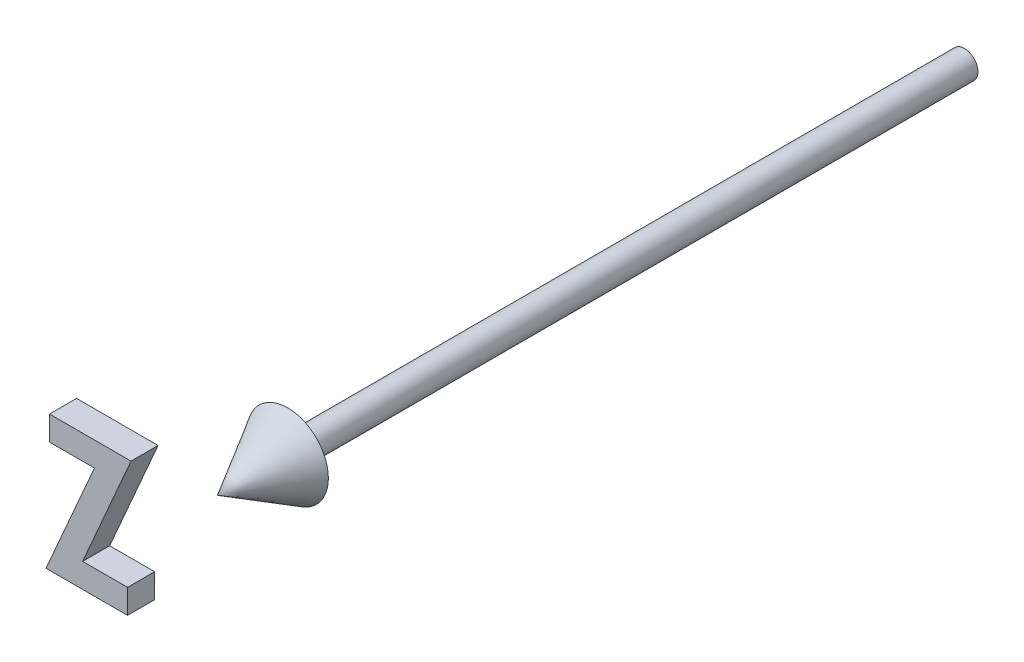
ISO-10303-21;
HEADER;
FILE_DESCRIPTION(('STEP AP214'),'2;1');
FILE_NAME('part.step','',(''),(''),'','','');
FILE_SCHEMA(('AUTOMOTIVE_DESIGN { 1 0 10303 214 1 1 1 1 }'));
ENDSEC;
DATA;
#1=APPLICATION_CONTEXT('core data for automotive mechanical design processes');
#2=APPLICATION_PROTOCOL_DEFINITION('international standard','automotive_design',2000,#1);
#3=PRODUCT_CONTEXT('',#1,'mechanical');
#4=PRODUCT('Part','Part','',(#3));
#5=PRODUCT_RELATED_PRODUCT_CATEGORY('part','',(#4));
#6=PRODUCT_DEFINITION_FORMATION('','',#4);
#7=PRODUCT_DEFINITION_CONTEXT('part definition',#1,'design');
#8=PRODUCT_DEFINITION('design','',#6,#7);
#9=PRODUCT_DEFINITION_SHAPE('','',#8);
#10=(LENGTH_UNIT() NAMED_UNIT(*) SI_UNIT(.MILLI.,.METRE.));
#11=(NAMED_UNIT(*) PLANE_ANGLE_UNIT() SI_UNIT($,.RADIAN.));
#12=(NAMED_UNIT(*) SI_UNIT($,.STERADIAN.) SOLID_ANGLE_UNIT());
#13=UNCERTAINTY_MEASURE_WITH_UNIT(LENGTH_MEASURE(1.E-05),#10,'distance_accuracy_value','');
#14=(GEOMETRIC_REPRESENTATION_CONTEXT(3) GLOBAL_UNCERTAINTY_ASSIGNED_CONTEXT((#13)) GLOBAL_UNIT_ASSIGNED_CONTEXT((#10,
#11,#12)) REPRESENTATION_CONTEXT('',''));
#15=CARTESIAN_POINT('',(0.,0.,0.));
#16=DIRECTION('',(0.,0.,1.));
#17=DIRECTION('',(1.,0.,0.));
#18=AXIS2_PLACEMENT_3D('',#15,#16,#17);
#19=CARTESIAN_POINT('',(-5.64102564102564,-8.2051282051282,56.1961524227066));
#20=DIRECTION('',(1.,0.,0.));
#21=DIRECTION('',(0.,0.,-1.));
#22=AXIS2_PLACEMENT_3D('',#19,#20,#21);
#23=PLANE('',#22);
#24=DIRECTION('',(0.,-1.,0.));
#25=VECTOR('',#24,1.);
#26=CARTESIAN_POINT('',(-5.64102564102564,-8.2051282051282,54.1961524227066));
#27=LINE('',#26,#25);
#28=CARTESIAN_POINT('',(-5.64102564102564,-8.2051282051282,54.1961524227066));
#29=VERTEX_POINT('',#28);
#30=CARTESIAN_POINT('',(-5.64102564102564,-10.,54.1961524227066));
#31=VERTEX_POINT('',#30);
#32=EDGE_CURVE('E149',#29,#31,#27,.T.);
#33=ORIENTED_EDGE('',*,*,#32,.F.);
#34=DIRECTION('',(0.,0.,-1.));
#35=VECTOR('',#34,1.);
#36=CARTESIAN_POINT('',(-5.64102564102564,-8.2051282051282,56.1961524227066));
#37=LINE('',#36,#35);
#38=CARTESIAN_POINT('',(-5.64102564102564,-8.2051282051282,56.1961524227066));
#39=VERTEX_POINT('',#38);
#40=EDGE_CURVE('E12',#39,#29,#37,.T.);
#41=ORIENTED_EDGE('',*,*,#40,.F.);
#42=DIRECTION('',(0.,-1.,0.));
#43=VECTOR('',#42,1.);
#44=CARTESIAN_POINT('',(-5.64102564102564,-8.2051282051282,56.1961524227066));
#45=LINE('',#44,#43);
#46=CARTESIAN_POINT('',(-5.64102564102564,-10.,56.1961524227066));
#47=VERTEX_POINT('',#46);
#48=EDGE_CURVE('E169',#39,#47,#45,.T.);
#49=ORIENTED_EDGE('',*,*,#48,.T.);
#50=DIRECTION('',(0.,0.,-1.));
#51=VECTOR('',#50,1.);
#52=CARTESIAN_POINT('',(-5.64102564102564,-10.,56.1961524227066));
#53=LINE('',#52,#51);
#54=EDGE_CURVE('E55',#47,#31,#53,.T.);
#55=ORIENTED_EDGE('',*,*,#54,.T.);
#56=EDGE_LOOP('',(#33,#41,#49,#55));
#57=FACE_BOUND('',#56,.T.);
#58=ADVANCED_FACE('F52',(#57),#23,.T.);
#59=CARTESIAN_POINT('',(-8.96233974358974,-8.2051282051282,56.1961524227066));
#60=DIRECTION('',(0.,1.,0.));
#61=DIRECTION('',(0.,0.,1.));
#62=AXIS2_PLACEMENT_3D('',#59,#60,#61);
#63=PLANE('',#62);
#64=DIRECTION('',(1.,0.,0.));
#65=VECTOR('',#64,1.);
#66=CARTESIAN_POINT('',(-8.96233974358974,-8.2051282051282,54.1961524227066));
#67=LINE('',#66,#65);
#68=CARTESIAN_POINT('',(-8.96233974358974,-8.2051282051282,54.1961524227066));
#69=VERTEX_POINT('',#68);
#70=EDGE_CURVE('E167',#69,#29,#67,.T.);
#71=ORIENTED_EDGE('',*,*,#70,.F.);
#72=DIRECTION('',(0.,0.,-1.));
#73=VECTOR('',#72,1.);
#74=CARTESIAN_POINT('',(-8.96233974358974,-8.2051282051282,56.1961524227066));
#75=LINE('',#74,#73);
#76=CARTESIAN_POINT('',(-8.96233974358974,-8.2051282051282,56.1961524227066));
#77=VERTEX_POINT('',#76);
#78=EDGE_CURVE('E61',#77,#69,#75,.T.);
#79=ORIENTED_EDGE('',*,*,#78,.F.);
#80=DIRECTION('',(1.,0.,0.));
#81=VECTOR('',#80,1.);
#82=CARTESIAN_POINT('',(-8.96233974358974,-8.2051282051282,56.1961524227066));
#83=LINE('',#82,#81);
#84=EDGE_CURVE('E139',#77,#39,#83,.T.);
#85=ORIENTED_EDGE('',*,*,#84,.T.);
#86=ORIENTED_EDGE('',*,*,#40,.T.);
#87=EDGE_LOOP('',(#71,#79,#85,#86));
#88=FACE_BOUND('',#87,.T.);
#89=ADVANCED_FACE('F181',(#88),#63,.T.);
#90=CARTESIAN_POINT('',(-5.38461538461539,0.,56.1961524227066));
#91=DIRECTION('',(0.916649716583048,-0.399691502396808,0.));
#92=DIRECTION('',(0.399691502396808,0.916649716583048,0.));
#93=AXIS2_PLACEMENT_3D('',#90,#91,#92);
#94=PLANE('',#93);
#95=DIRECTION('',(-0.399691502396808,-0.916649716583048,0.));
#96=VECTOR('',#95,1.);
#97=CARTESIAN_POINT('',(-5.38461538461539,0.,54.1961524227066));
#98=LINE('',#97,#96);
#99=CARTESIAN_POINT('',(-5.38461538461539,0.,54.1961524227066));
#100=VERTEX_POINT('',#99);
#101=EDGE_CURVE('E126',#100,#69,#98,.T.);
#102=ORIENTED_EDGE('',*,*,#101,.F.);
#103=DIRECTION('',(0.,0.,-1.));
#104=VECTOR('',#103,1.);
#105=CARTESIAN_POINT('',(-5.38461538461539,0.,56.1961524227066));
#106=LINE('',#105,#104);
#107=CARTESIAN_POINT('',(-5.38461538461539,0.,56.1961524227066));
#108=VERTEX_POINT('',#107);
#109=EDGE_CURVE('E121',#108,#100,#106,.T.);
#110=ORIENTED_EDGE('',*,*,#109,.F.);
#111=DIRECTION('',(-0.399691502396808,-0.916649716583048,0.));
#112=VECTOR('',#111,1.);
#113=CARTESIAN_POINT('',(-5.38461538461539,0.,56.1961524227066));
#114=LINE('',#113,#112);
#115=EDGE_CURVE('E124',#108,#77,#114,.T.);
#116=ORIENTED_EDGE('',*,*,#115,.T.);
#117=ORIENTED_EDGE('',*,*,#78,.T.);
#118=EDGE_LOOP('',(#102,#110,#116,#117));
#119=FACE_BOUND('',#118,.T.);
#120=ADVANCED_FACE('F123',(#119),#94,.T.);
#121=CARTESIAN_POINT('',(-11.4102564102564,0.,56.1961524227066));
#122=DIRECTION('',(0.,1.,0.));
#123=DIRECTION('',(0.,0.,1.));
#124=AXIS2_PLACEMENT_3D('',#121,#122,#123);
#125=PLANE('',#124);
#126=DIRECTION('',(1.,0.,0.));
#127=VECTOR('',#126,1.);
#128=CARTESIAN_POINT('',(-11.4102564102564,0.,54.1961524227066));
#129=LINE('',#128,#127);
#130=CARTESIAN_POINT('',(-11.4102564102564,0.,54.1961524227066));
#131=VERTEX_POINT('',#130);
#132=EDGE_CURVE('E164',#131,#100,#129,.T.);
#133=ORIENTED_EDGE('',*,*,#132,.F.);
#134=DIRECTION('',(0.,0.,-1.));
#135=VECTOR('',#134,1.);
#136=CARTESIAN_POINT('',(-11.4102564102564,0.,56.1961524227066));
#137=LINE('',#136,#135);
#138=CARTESIAN_POINT('',(-11.4102564102564,0.,56.1961524227066));
#139=VERTEX_POINT('',#138);
#140=EDGE_CURVE('E131',#139,#131,#137,.T.);
#141=ORIENTED_EDGE('',*,*,#140,.F.);
#142=DIRECTION('',(1.,0.,0.));
#143=VECTOR('',#142,1.);
#144=CARTESIAN_POINT('',(-11.4102564102564,0.,56.1961524227066));
#145=LINE('',#144,#143);
#146=EDGE_CURVE('E137',#139,#108,#145,.T.);
#147=ORIENTED_EDGE('',*,*,#146,.T.);
#148=ORIENTED_EDGE('',*,*,#109,.T.);
#149=EDGE_LOOP('',(#133,#141,#147,#148));
#150=FACE_BOUND('',#149,.T.);
#151=ADVANCED_FACE('F141',(#150),#125,.T.);
#152=CARTESIAN_POINT('',(-11.4102564102564,-1.79487179487179,56.1961524227066));
#153=DIRECTION('',(-1.,0.,0.));
#154=DIRECTION('',(0.,0.,1.));
#155=AXIS2_PLACEMENT_3D('',#152,#153,#154);
#156=PLANE('',#155);
#157=DIRECTION('',(0.,1.,0.));
#158=VECTOR('',#157,1.);
#159=CARTESIAN_POINT('',(-11.4102564102564,-1.79487179487179,54.1961524227066));
#160=LINE('',#159,#158);
#161=CARTESIAN_POINT('',(-11.4102564102564,-1.79487179487179,54.1961524227066));
#162=VERTEX_POINT('',#161);
#163=EDGE_CURVE('E161',#162,#131,#160,.T.);
#164=ORIENTED_EDGE('',*,*,#163,.F.);
#165=DIRECTION('',(0.,0.,-1.));
#166=VECTOR('',#165,1.);
#167=CARTESIAN_POINT('',(-11.4102564102564,-1.79487179487179,56.1961524227066));
#168=LINE('',#167,#166);
#169=CARTESIAN_POINT('',(-11.4102564102564,-1.79487179487179,56.1961524227066));
#170=VERTEX_POINT('',#169);
#171=EDGE_CURVE('E173',#170,#162,#168,.T.);
#172=ORIENTED_EDGE('',*,*,#171,.F.);
#173=DIRECTION('',(0.,1.,0.));
#174=VECTOR('',#173,1.);
#175=CARTESIAN_POINT('',(-11.4102564102564,-1.79487179487179,56.1961524227066));
#176=LINE('',#175,#174);
#177=EDGE_CURVE('E142',#170,#139,#176,.T.);
#178=ORIENTED_EDGE('',*,*,#177,.T.);
#179=ORIENTED_EDGE('',*,*,#140,.T.);
#180=EDGE_LOOP('',(#164,#172,#178,#179));
#181=FACE_BOUND('',#180,.T.);
#182=ADVANCED_FACE('F194',(#181),#156,.T.);
#183=CARTESIAN_POINT('',(-8.0869391025641,-1.79487179487179,56.1961524227066));
#184=DIRECTION('',(0.,-1.,0.));
#185=DIRECTION('',(0.,0.,-1.));
#186=AXIS2_PLACEMENT_3D('',#183,#184,#185);
#187=PLANE('',#186);
#188=DIRECTION('',(-1.,0.,0.));
#189=VECTOR('',#188,1.);
#190=CARTESIAN_POINT('',(-8.0869391025641,-1.79487179487179,54.1961524227066));
#191=LINE('',#190,#189);
#192=CARTESIAN_POINT('',(-8.0869391025641,-1.79487179487179,54.1961524227066));
#193=VERTEX_POINT('',#192);
#194=EDGE_CURVE('E158',#193,#162,#191,.T.);
#195=ORIENTED_EDGE('',*,*,#194,.F.);
#196=DIRECTION('',(0.,0.,-1.));
#197=VECTOR('',#196,1.);
#198=CARTESIAN_POINT('',(-8.0869391025641,-1.79487179487179,56.1961524227066));
#199=LINE('',#198,#197);
#200=CARTESIAN_POINT('',(-8.0869391025641,-1.79487179487179,56.1961524227066));
#201=VERTEX_POINT('',#200);
#202=EDGE_CURVE('E175',#201,#193,#199,.T.);
#203=ORIENTED_EDGE('',*,*,#202,.F.);
#204=DIRECTION('',(-1.,0.,0.));
#205=VECTOR('',#204,1.);
#206=CARTESIAN_POINT('',(-8.0869391025641,-1.79487179487179,56.1961524227066));
#207=LINE('',#206,#205);
#208=EDGE_CURVE('E144',#201,#170,#207,.T.);
#209=ORIENTED_EDGE('',*,*,#208,.T.);
#210=ORIENTED_EDGE('',*,*,#171,.T.);
#211=EDGE_LOOP('',(#195,#203,#209,#210));
#212=FACE_BOUND('',#211,.T.);
#213=ADVANCED_FACE('F197',(#212),#187,.T.);
#214=CARTESIAN_POINT('',(-11.6666666666667,-10.,56.1961524227066));
#215=DIRECTION('',(-0.916567712577055,0.399879517181445,0.));
#216=DIRECTION('',(-0.399879517181445,-0.916567712577055,0.));
#217=AXIS2_PLACEMENT_3D('',#214,#215,#216);
#218=PLANE('',#217);
#219=DIRECTION('',(0.399879517181444,0.916567712577055,0.));
#220=VECTOR('',#219,1.);
#221=CARTESIAN_POINT('',(-11.6666666666667,-10.,54.1961524227066));
#222=LINE('',#221,#220);
#223=CARTESIAN_POINT('',(-11.6666666666667,-10.,54.1961524227066));
#224=VERTEX_POINT('',#223);
#225=EDGE_CURVE('E155',#224,#193,#222,.T.);
#226=ORIENTED_EDGE('',*,*,#225,.F.);
#227=DIRECTION('',(0.,0.,-1.));
#228=VECTOR('',#227,1.);
#229=CARTESIAN_POINT('',(-11.6666666666667,-10.,56.1961524227066));
#230=LINE('',#229,#228);
#231=CARTESIAN_POINT('',(-11.6666666666667,-10.,56.1961524227066));
#232=VERTEX_POINT('',#231);
#233=EDGE_CURVE('E176',#232,#224,#230,.T.);
#234=ORIENTED_EDGE('',*,*,#233,.F.);
#235=DIRECTION('',(0.399879517181444,0.916567712577055,0.));
#236=VECTOR('',#235,1.);
#237=CARTESIAN_POINT('',(-11.6666666666667,-10.,56.1961524227066));
#238=LINE('',#237,#236);
#239=EDGE_CURVE('E292',#232,#201,#238,.T.);
#240=ORIENTED_EDGE('',*,*,#239,.T.);
#241=ORIENTED_EDGE('',*,*,#202,.T.);
#242=EDGE_LOOP('',(#226,#234,#240,#241));
#243=FACE_BOUND('',#242,.T.);
#244=ADVANCED_FACE('F201',(#243),#218,.T.);
#245=CARTESIAN_POINT('',(-5.64102564102564,-10.,56.1961524227066));
#246=DIRECTION('',(0.,-1.,0.));
#247=DIRECTION('',(0.,0.,-1.));
#248=AXIS2_PLACEMENT_3D('',#245,#246,#247);
#249=PLANE('',#248);
#250=DIRECTION('',(-1.,0.,0.));
#251=VECTOR('',#250,1.);
#252=CARTESIAN_POINT('',(-5.64102564102564,-10.,54.1961524227066));
#253=LINE('',#252,#251);
#254=EDGE_CURVE('E152',#31,#224,#253,.T.);
#255=ORIENTED_EDGE('',*,*,#254,.F.);
#256=ORIENTED_EDGE('',*,*,#54,.F.);
#257=DIRECTION('',(-1.,0.,0.));
#258=VECTOR('',#257,1.);
#259=CARTESIAN_POINT('',(-5.64102564102564,-10.,56.1961524227066));
#260=LINE('',#259,#258);
#261=EDGE_CURVE('E293',#47,#232,#260,.T.);
#262=ORIENTED_EDGE('',*,*,#261,.T.);
#263=ORIENTED_EDGE('',*,*,#233,.T.);
#264=EDGE_LOOP('',(#255,#256,#262,#263));
#265=FACE_BOUND('',#264,.T.);
#266=ADVANCED_FACE('F178',(#265),#249,.T.);
#267=CARTESIAN_POINT('',(0.,0.,56.1961524227066));
#268=DIRECTION('',(0.,0.,-1.));
#269=DIRECTION('',(-1.,0.,0.));
#270=AXIS2_PLACEMENT_3D('',#267,#268,#269);
#271=PLANE('',#270);
#272=ORIENTED_EDGE('',*,*,#48,.F.);
#273=ORIENTED_EDGE('',*,*,#84,.F.);
#274=ORIENTED_EDGE('',*,*,#115,.F.);
#275=ORIENTED_EDGE('',*,*,#146,.F.);
#276=ORIENTED_EDGE('',*,*,#177,.F.);
#277=ORIENTED_EDGE('',*,*,#208,.F.);
#278=ORIENTED_EDGE('',*,*,#239,.F.);
#279=ORIENTED_EDGE('',*,*,#261,.F.);
#280=EDGE_LOOP('',(#272,#273,#274,#275,#276,#277,#278,#279));
#281=FACE_BOUND('',#280,.T.);
#282=ADVANCED_FACE('F135',(#281),#271,.F.);
#283=CARTESIAN_POINT('',(0.,0.,54.1961524227066));
#284=DIRECTION('',(0.,0.,-1.));
#285=DIRECTION('',(-1.,0.,0.));
#286=AXIS2_PLACEMENT_3D('',#283,#284,#285);
#287=PLANE('',#286);
#288=ORIENTED_EDGE('',*,*,#32,.T.);
#289=ORIENTED_EDGE('',*,*,#254,.T.);
#290=ORIENTED_EDGE('',*,*,#225,.T.);
#291=ORIENTED_EDGE('',*,*,#194,.T.);
#292=ORIENTED_EDGE('',*,*,#163,.T.);
#293=ORIENTED_EDGE('',*,*,#132,.T.);
#294=ORIENTED_EDGE('',*,*,#101,.T.);
#295=ORIENTED_EDGE('',*,*,#70,.T.);
#296=EDGE_LOOP('',(#288,#289,#290,#291,#292,#293,#294,#295));
#297=FACE_BOUND('',#296,.T.);
#298=ADVANCED_FACE('F180',(#297),#287,.T.);
#299=CLOSED_SHELL('',(#58,#89,#120,#151,#182,#213,#244,#266,#282,#298));
#300=MANIFOLD_SOLID_BREP('B2',#299);
#301=CARTESIAN_POINT('',(0.,0.,50.));
#302=DIRECTION('',(0.,0.,-1.));
#303=DIRECTION('',(-1.,0.,0.));
#304=AXIS2_PLACEMENT_3D('',#301,#302,#303);
#305=CYLINDRICAL_SURFACE('',#304,1.);
#306=CARTESIAN_POINT('',(0.,0.,50.));
#307=DIRECTION('',(0.,0.,1.));
#308=DIRECTION('',(1.,0.,0.));
#309=AXIS2_PLACEMENT_3D('',#306,#307,#308);
#310=CIRCLE('',#309,1.);
#311=CARTESIAN_POINT('',(1.,0.,50.));
#312=VERTEX_POINT('',#311);
#313=EDGE_CURVE('E50',#312,#312,#310,.T.);
#314=ORIENTED_EDGE('',*,*,#313,.F.);
#315=EDGE_LOOP('',(#314));
#316=FACE_BOUND('',#315,.T.);
#317=CARTESIAN_POINT('',(0.,0.,0.));
#318=DIRECTION('',(0.,0.,1.));
#319=DIRECTION('',(1.,0.,0.));
#320=AXIS2_PLACEMENT_3D('',#317,#318,#319);
#321=CIRCLE('',#320,1.);
#322=CARTESIAN_POINT('',(1.,0.,0.));
#323=VERTEX_POINT('',#322);
#324=EDGE_CURVE('E302',#323,#323,#321,.T.);
#325=ORIENTED_EDGE('',*,*,#324,.T.);
#326=EDGE_LOOP('',(#325));
#327=FACE_BOUND('',#326,.T.);
#328=ADVANCED_FACE('F299',(#316,#327),#305,.T.);
#329=CARTESIAN_POINT('',(0.,0.,0.));
#330=DIRECTION('',(0.,0.,1.));
#331=DIRECTION('',(1.,0.,0.));
#332=AXIS2_PLACEMENT_3D('',#329,#330,#331);
#333=PLANE('',#332);
#334=ORIENTED_EDGE('',*,*,#324,.F.);
#335=EDGE_LOOP('',(#334));
#336=FACE_BOUND('',#335,.T.);
#337=ADVANCED_FACE('F325',(#336),#333,.F.);
#338=CARTESIAN_POINT('',(0.,0.,50.));
#339=DIRECTION('',(0.,0.,1.));
#340=DIRECTION('',(1.,0.,0.));
#341=AXIS2_PLACEMENT_3D('',#338,#339,#340);
#342=PLANE('',#341);
#343=ORIENTED_EDGE('',*,*,#313,.T.);
#344=EDGE_LOOP('',(#343));
#345=FACE_BOUND('',#344,.T.);
#346=CARTESIAN_POINT('',(0.,0.,50.));
#347=DIRECTION('',(0.,0.,1.));
#348=DIRECTION('',(1.,0.,0.));
#349=AXIS2_PLACEMENT_3D('',#346,#347,#348);
#350=CIRCLE('',#349,3.);
#351=CARTESIAN_POINT('',(3.,0.,50.));
#352=VERTEX_POINT('',#351);
#353=EDGE_CURVE('E316',#352,#352,#350,.T.);
#354=ORIENTED_EDGE('',*,*,#353,.F.);
#355=EDGE_LOOP('',(#354));
#356=FACE_BOUND('',#355,.T.);
#357=ADVANCED_FACE('F312',(#345,#356),#342,.F.);
#358=CARTESIAN_POINT('',(0.,0.,50.));
#359=DIRECTION('',(0.,0.,-1.));
#360=DIRECTION('',(-1.,0.,0.));
#361=AXIS2_PLACEMENT_3D('',#358,#359,#360);
#362=CONICAL_SURFACE('',#361,3.,0.523598775598304);
#363=CARTESIAN_POINT('',(0.,0.,55.1961524227066));
#364=VERTEX_POINT('',#363);
#365=VERTEX_LOOP('',#364);
#366=FACE_BOUND('',#365,.T.);
#367=ORIENTED_EDGE('',*,*,#353,.T.);
#368=EDGE_LOOP('',(#367));
#369=FACE_BOUND('',#368,.T.);
#370=ADVANCED_FACE('F309',(#366,#369),#362,.T.);
#371=CLOSED_SHELL('',(#328,#337,#357,#370));
#372=MANIFOLD_SOLID_BREP('B6',#371);
#373=ADVANCED_BREP_SHAPE_REPRESENTATION('',(#18,#300,#372),#14);
#374=SHAPE_DEFINITION_REPRESENTATION(#9,#373);
ENDSEC;
END-ISO-10303-21;
